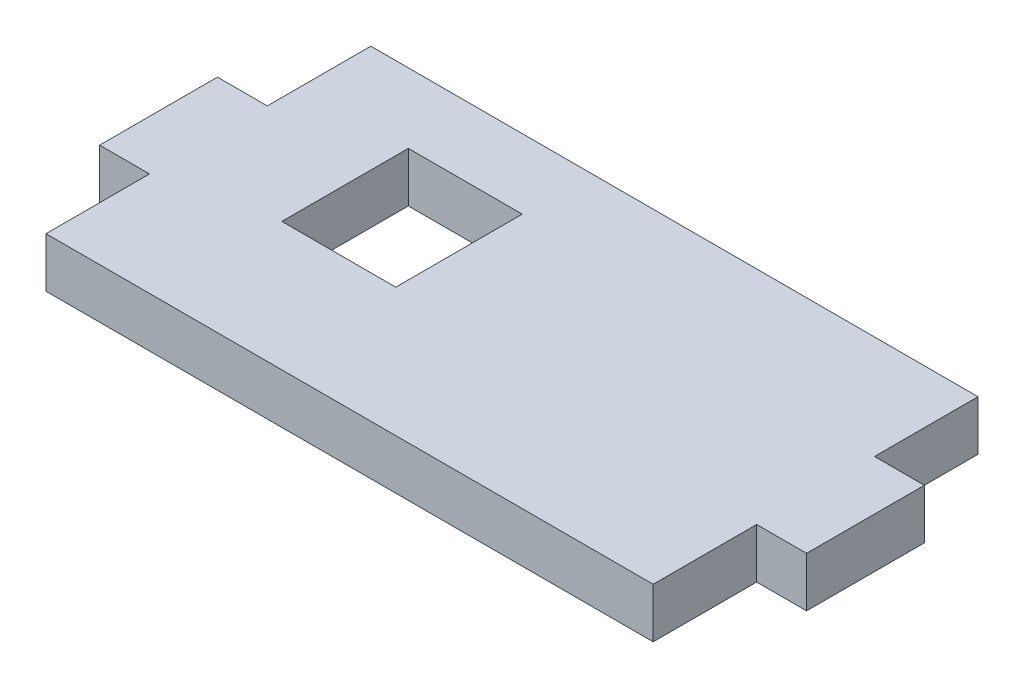
ISO-10303-21;
HEADER;
FILE_DESCRIPTION(('STEP AP214'),'2;1');
FILE_NAME('part.step','',(''),(''),'','','');
FILE_SCHEMA(('AUTOMOTIVE_DESIGN { 1 0 10303 214 1 1 1 1 }'));
ENDSEC;
DATA;
#1=APPLICATION_CONTEXT('core data for automotive mechanical design processes');
#2=APPLICATION_PROTOCOL_DEFINITION('international standard','automotive_design',2000,#1);
#3=PRODUCT_CONTEXT('',#1,'mechanical');
#4=PRODUCT('Part','Part','',(#3));
#5=PRODUCT_RELATED_PRODUCT_CATEGORY('part','',(#4));
#6=PRODUCT_DEFINITION_FORMATION('','',#4);
#7=PRODUCT_DEFINITION_CONTEXT('part definition',#1,'design');
#8=PRODUCT_DEFINITION('design','',#6,#7);
#9=PRODUCT_DEFINITION_SHAPE('','',#8);
#10=(LENGTH_UNIT() NAMED_UNIT(*) SI_UNIT(.MILLI.,.METRE.));
#11=(NAMED_UNIT(*) PLANE_ANGLE_UNIT() SI_UNIT($,.RADIAN.));
#12=(NAMED_UNIT(*) SI_UNIT($,.STERADIAN.) SOLID_ANGLE_UNIT());
#13=UNCERTAINTY_MEASURE_WITH_UNIT(LENGTH_MEASURE(1.E-05),#10,'distance_accuracy_value','');
#14=(GEOMETRIC_REPRESENTATION_CONTEXT(3) GLOBAL_UNCERTAINTY_ASSIGNED_CONTEXT((#13)) GLOBAL_UNIT_ASSIGNED_CONTEXT((#10,
#11,#12)) REPRESENTATION_CONTEXT('',''));
#15=CARTESIAN_POINT('',(0.,0.,0.));
#16=DIRECTION('',(0.,0.,1.));
#17=DIRECTION('',(1.,0.,0.));
#18=AXIS2_PLACEMENT_3D('',#15,#16,#17);
#19=CARTESIAN_POINT('',(45.,3.175,20.675));
#20=DIRECTION('',(-1.,0.,0.));
#21=DIRECTION('',(0.,0.,1.));
#22=AXIS2_PLACEMENT_3D('',#19,#20,#21);
#23=PLANE('',#22);
#24=DIRECTION('',(0.,0.,-1.));
#25=VECTOR('',#24,1.);
#26=CARTESIAN_POINT('',(45.,3.175,20.675));
#27=LINE('',#26,#25);
#28=CARTESIAN_POINT('',(45.,3.175,7.50000000000001));
#29=VERTEX_POINT('',#28);
#30=CARTESIAN_POINT('',(45.,3.175,-7.50000000000001));
#31=VERTEX_POINT('',#30);
#32=EDGE_CURVE('E259',#29,#31,#27,.T.);
#33=ORIENTED_EDGE('',*,*,#32,.F.);
#34=DIRECTION('',(0.,1.,0.));
#35=VECTOR('',#34,1.);
#36=CARTESIAN_POINT('',(45.,-3.175,7.50000000000001));
#37=LINE('',#36,#35);
#38=CARTESIAN_POINT('',(45.,-3.175,7.50000000000001));
#39=VERTEX_POINT('',#38);
#40=EDGE_CURVE('E232',#39,#29,#37,.T.);
#41=ORIENTED_EDGE('',*,*,#40,.F.);
#42=DIRECTION('',(0.,0.,-1.));
#43=VECTOR('',#42,1.);
#44=CARTESIAN_POINT('',(45.,-3.175,20.675));
#45=LINE('',#44,#43);
#46=CARTESIAN_POINT('',(45.,-3.175,-7.50000000000001));
#47=VERTEX_POINT('',#46);
#48=EDGE_CURVE('E255',#39,#47,#45,.T.);
#49=ORIENTED_EDGE('',*,*,#48,.T.);
#50=DIRECTION('',(0.,1.,0.));
#51=VECTOR('',#50,1.);
#52=CARTESIAN_POINT('',(45.,-3.175,-7.50000000000001));
#53=LINE('',#52,#51);
#54=EDGE_CURVE('E198',#47,#31,#53,.T.);
#55=ORIENTED_EDGE('',*,*,#54,.T.);
#56=EDGE_LOOP('',(#33,#41,#49,#55));
#57=FACE_BOUND('',#56,.T.);
#58=ADVANCED_FACE('F36',(#57),#23,.F.);
#59=CARTESIAN_POINT('',(-45.,3.175,-20.675));
#60=DIRECTION('',(0.,0.,1.));
#61=DIRECTION('',(1.,0.,0.));
#62=AXIS2_PLACEMENT_3D('',#59,#60,#61);
#63=PLANE('',#62);
#64=DIRECTION('',(-1.,0.,0.));
#65=VECTOR('',#64,1.);
#66=CARTESIAN_POINT('',(-45.,3.175,-20.675));
#67=LINE('',#66,#65);
#68=CARTESIAN_POINT('',(38.65,3.175,-20.675));
#69=VERTEX_POINT('',#68);
#70=CARTESIAN_POINT('',(-38.65,3.175,-20.675));
#71=VERTEX_POINT('',#70);
#72=EDGE_CURVE('E262',#69,#71,#67,.T.);
#73=ORIENTED_EDGE('',*,*,#72,.F.);
#74=DIRECTION('',(0.,1.,0.));
#75=VECTOR('',#74,1.);
#76=CARTESIAN_POINT('',(38.65,-3.175,-20.675));
#77=LINE('',#76,#75);
#78=CARTESIAN_POINT('',(38.65,-3.175,-20.675));
#79=VERTEX_POINT('',#78);
#80=EDGE_CURVE('E214',#79,#69,#77,.T.);
#81=ORIENTED_EDGE('',*,*,#80,.F.);
#82=DIRECTION('',(-1.,0.,0.));
#83=VECTOR('',#82,1.);
#84=CARTESIAN_POINT('',(-45.,-3.175,-20.675));
#85=LINE('',#84,#83);
#86=CARTESIAN_POINT('',(-38.65,-3.175,-20.675));
#87=VERTEX_POINT('',#86);
#88=EDGE_CURVE('E269',#79,#87,#85,.T.);
#89=ORIENTED_EDGE('',*,*,#88,.T.);
#90=DIRECTION('',(0.,1.,0.));
#91=VECTOR('',#90,1.);
#92=CARTESIAN_POINT('',(-38.65,-3.175,-20.675));
#93=LINE('',#92,#91);
#94=EDGE_CURVE('E200',#87,#71,#93,.T.);
#95=ORIENTED_EDGE('',*,*,#94,.T.);
#96=EDGE_LOOP('',(#73,#81,#89,#95));
#97=FACE_BOUND('',#96,.T.);
#98=ADVANCED_FACE('F314',(#97),#63,.F.);
#99=CARTESIAN_POINT('',(-45.,3.175,20.675));
#100=DIRECTION('',(1.,0.,0.));
#101=DIRECTION('',(0.,0.,-1.));
#102=AXIS2_PLACEMENT_3D('',#99,#100,#101);
#103=PLANE('',#102);
#104=DIRECTION('',(0.,0.,1.));
#105=VECTOR('',#104,1.);
#106=CARTESIAN_POINT('',(-45.,3.175,20.675));
#107=LINE('',#106,#105);
#108=CARTESIAN_POINT('',(-45.,3.175,-7.5));
#109=VERTEX_POINT('',#108);
#110=CARTESIAN_POINT('',(-45.,3.175,7.5));
#111=VERTEX_POINT('',#110);
#112=EDGE_CURVE('E44',#109,#111,#107,.T.);
#113=ORIENTED_EDGE('',*,*,#112,.F.);
#114=DIRECTION('',(0.,1.,0.));
#115=VECTOR('',#114,1.);
#116=CARTESIAN_POINT('',(-45.,-3.175,-7.5));
#117=LINE('',#116,#115);
#118=CARTESIAN_POINT('',(-45.,-3.175,-7.5));
#119=VERTEX_POINT('',#118);
#120=EDGE_CURVE('E194',#119,#109,#117,.T.);
#121=ORIENTED_EDGE('',*,*,#120,.F.);
#122=DIRECTION('',(0.,0.,1.));
#123=VECTOR('',#122,1.);
#124=CARTESIAN_POINT('',(-45.,-3.175,20.675));
#125=LINE('',#124,#123);
#126=CARTESIAN_POINT('',(-45.,-3.175,7.5));
#127=VERTEX_POINT('',#126);
#128=EDGE_CURVE('E271',#119,#127,#125,.T.);
#129=ORIENTED_EDGE('',*,*,#128,.T.);
#130=DIRECTION('',(0.,1.,0.));
#131=VECTOR('',#130,1.);
#132=CARTESIAN_POINT('',(-45.,-3.175,7.5));
#133=LINE('',#132,#131);
#134=EDGE_CURVE('E252',#127,#111,#133,.T.);
#135=ORIENTED_EDGE('',*,*,#134,.T.);
#136=EDGE_LOOP('',(#113,#121,#129,#135));
#137=FACE_BOUND('',#136,.T.);
#138=ADVANCED_FACE('F307',(#137),#103,.F.);
#139=CARTESIAN_POINT('',(-45.,3.175,20.675));
#140=DIRECTION('',(0.,0.,-1.));
#141=DIRECTION('',(-1.,0.,0.));
#142=AXIS2_PLACEMENT_3D('',#139,#140,#141);
#143=PLANE('',#142);
#144=DIRECTION('',(1.,0.,0.));
#145=VECTOR('',#144,1.);
#146=CARTESIAN_POINT('',(-45.,-3.175,20.675));
#147=LINE('',#146,#145);
#148=CARTESIAN_POINT('',(-38.65,-3.175,20.675));
#149=VERTEX_POINT('',#148);
#150=CARTESIAN_POINT('',(38.65,-3.175,20.675));
#151=VERTEX_POINT('',#150);
#152=EDGE_CURVE('E39',#149,#151,#147,.T.);
#153=ORIENTED_EDGE('',*,*,#152,.T.);
#154=DIRECTION('',(0.,1.,0.));
#155=VECTOR('',#154,1.);
#156=CARTESIAN_POINT('',(38.65,-3.175,20.675));
#157=LINE('',#156,#155);
#158=CARTESIAN_POINT('',(38.65,3.175,20.675));
#159=VERTEX_POINT('',#158);
#160=EDGE_CURVE('E218',#151,#159,#157,.T.);
#161=ORIENTED_EDGE('',*,*,#160,.T.);
#162=DIRECTION('',(1.,0.,0.));
#163=VECTOR('',#162,1.);
#164=CARTESIAN_POINT('',(-45.,3.175,20.675));
#165=LINE('',#164,#163);
#166=CARTESIAN_POINT('',(-38.65,3.175,20.675));
#167=VERTEX_POINT('',#166);
#168=EDGE_CURVE('E11',#167,#159,#165,.T.);
#169=ORIENTED_EDGE('',*,*,#168,.F.);
#170=DIRECTION('',(0.,1.,0.));
#171=VECTOR('',#170,1.);
#172=CARTESIAN_POINT('',(-38.65,-3.175,20.675));
#173=LINE('',#172,#171);
#174=EDGE_CURVE('E248',#149,#167,#173,.T.);
#175=ORIENTED_EDGE('',*,*,#174,.F.);
#176=EDGE_LOOP('',(#153,#161,#169,#175));
#177=FACE_BOUND('',#176,.T.);
#178=ADVANCED_FACE('F280',(#177),#143,.F.);
#179=CARTESIAN_POINT('',(0.,3.175,0.));
#180=DIRECTION('',(0.,-1.,0.));
#181=DIRECTION('',(0.,0.,-1.));
#182=AXIS2_PLACEMENT_3D('',#179,#180,#181);
#183=PLANE('',#182);
#184=DIRECTION('',(1.,0.,0.));
#185=VECTOR('',#184,1.);
#186=CARTESIAN_POINT('',(-10.4899999999817,3.175,-11.7924402745096));
#187=LINE('',#186,#185);
#188=CARTESIAN_POINT('',(-24.9899999999817,3.175,-11.7924402745096));
#189=VERTEX_POINT('',#188);
#190=CARTESIAN_POINT('',(-10.4899999999817,3.175,-11.7924402745096));
#191=VERTEX_POINT('',#190);
#192=EDGE_CURVE('E158',#189,#191,#187,.T.);
#193=ORIENTED_EDGE('',*,*,#192,.T.);
#194=DIRECTION('',(0.,0.,1.));
#195=VECTOR('',#194,1.);
#196=CARTESIAN_POINT('',(-10.4899999999817,3.175,4.30755972549035));
#197=LINE('',#196,#195);
#198=CARTESIAN_POINT('',(-10.4899999999817,3.175,4.30755972549035));
#199=VERTEX_POINT('',#198);
#200=EDGE_CURVE('E152',#191,#199,#197,.T.);
#201=ORIENTED_EDGE('',*,*,#200,.T.);
#202=DIRECTION('',(-1.,0.,0.));
#203=VECTOR('',#202,1.);
#204=CARTESIAN_POINT('',(-10.4899999999817,3.175,4.30755972549035));
#205=LINE('',#204,#203);
#206=CARTESIAN_POINT('',(-24.9899999999817,3.175,4.30755972549035));
#207=VERTEX_POINT('',#206);
#208=EDGE_CURVE('E161',#199,#207,#205,.T.);
#209=ORIENTED_EDGE('',*,*,#208,.T.);
#210=DIRECTION('',(0.,0.,-1.));
#211=VECTOR('',#210,1.);
#212=CARTESIAN_POINT('',(-24.9899999999817,3.175,4.30755972549035));
#213=LINE('',#212,#211);
#214=EDGE_CURVE('E52',#207,#189,#213,.T.);
#215=ORIENTED_EDGE('',*,*,#214,.T.);
#216=EDGE_LOOP('',(#193,#201,#209,#215));
#217=FACE_BOUND('',#216,.T.);
#218=ORIENTED_EDGE('',*,*,#168,.T.);
#219=DIRECTION('',(0.,0.,1.));
#220=VECTOR('',#219,1.);
#221=CARTESIAN_POINT('',(38.65,3.175,20.675));
#222=LINE('',#221,#220);
#223=CARTESIAN_POINT('',(38.65,3.175,7.50000000000001));
#224=VERTEX_POINT('',#223);
#225=EDGE_CURVE('E229',#224,#159,#222,.T.);
#226=ORIENTED_EDGE('',*,*,#225,.F.);
#227=DIRECTION('',(-1.,0.,0.));
#228=VECTOR('',#227,1.);
#229=CARTESIAN_POINT('',(45.,3.175,7.50000000000001));
#230=LINE('',#229,#228);
#231=EDGE_CURVE('E183',#29,#224,#230,.T.);
#232=ORIENTED_EDGE('',*,*,#231,.F.);
#233=ORIENTED_EDGE('',*,*,#32,.T.);
#234=DIRECTION('',(1.,0.,0.));
#235=VECTOR('',#234,1.);
#236=CARTESIAN_POINT('',(45.,3.175,-7.50000000000001));
#237=LINE('',#236,#235);
#238=CARTESIAN_POINT('',(38.65,3.175,-7.50000000000001));
#239=VERTEX_POINT('',#238);
#240=EDGE_CURVE('E211',#239,#31,#237,.T.);
#241=ORIENTED_EDGE('',*,*,#240,.F.);
#242=DIRECTION('',(0.,0.,1.));
#243=VECTOR('',#242,1.);
#244=CARTESIAN_POINT('',(38.65,3.175,-20.675));
#245=LINE('',#244,#243);
#246=EDGE_CURVE('E215',#69,#239,#245,.T.);
#247=ORIENTED_EDGE('',*,*,#246,.F.);
#248=ORIENTED_EDGE('',*,*,#72,.T.);
#249=DIRECTION('',(0.,0.,-1.));
#250=VECTOR('',#249,1.);
#251=CARTESIAN_POINT('',(-38.65,3.175,-20.675));
#252=LINE('',#251,#250);
#253=CARTESIAN_POINT('',(-38.65,3.175,-7.5));
#254=VERTEX_POINT('',#253);
#255=EDGE_CURVE('E191',#254,#71,#252,.T.);
#256=ORIENTED_EDGE('',*,*,#255,.F.);
#257=DIRECTION('',(1.,0.,0.));
#258=VECTOR('',#257,1.);
#259=CARTESIAN_POINT('',(-45.,3.175,-7.5));
#260=LINE('',#259,#258);
#261=EDGE_CURVE('E195',#109,#254,#260,.T.);
#262=ORIENTED_EDGE('',*,*,#261,.F.);
#263=ORIENTED_EDGE('',*,*,#112,.T.);
#264=DIRECTION('',(-1.,0.,0.));
#265=VECTOR('',#264,1.);
#266=CARTESIAN_POINT('',(-45.,3.175,7.5));
#267=LINE('',#266,#265);
#268=CARTESIAN_POINT('',(-38.65,3.175,7.5));
#269=VERTEX_POINT('',#268);
#270=EDGE_CURVE('E245',#269,#111,#267,.T.);
#271=ORIENTED_EDGE('',*,*,#270,.F.);
#272=DIRECTION('',(0.,0.,-1.));
#273=VECTOR('',#272,1.);
#274=CARTESIAN_POINT('',(-38.65,3.175,20.675));
#275=LINE('',#274,#273);
#276=EDGE_CURVE('E203',#167,#269,#275,.T.);
#277=ORIENTED_EDGE('',*,*,#276,.F.);
#278=EDGE_LOOP('',(#218,#226,#232,#233,#241,#247,#248,#256,#262,#263,#271,#277));
#279=FACE_BOUND('',#278,.T.);
#280=ADVANCED_FACE('F165',(#217,#279),#183,.F.);
#281=CARTESIAN_POINT('',(0.,-3.175,0.));
#282=DIRECTION('',(0.,-1.,0.));
#283=DIRECTION('',(0.,0.,-1.));
#284=AXIS2_PLACEMENT_3D('',#281,#282,#283);
#285=PLANE('',#284);
#286=DIRECTION('',(0.,0.,1.));
#287=VECTOR('',#286,1.);
#288=CARTESIAN_POINT('',(-10.4899999999817,-3.175,4.30755972549035));
#289=LINE('',#288,#287);
#290=CARTESIAN_POINT('',(-10.4899999999817,-3.175,-11.7924402745096));
#291=VERTEX_POINT('',#290);
#292=CARTESIAN_POINT('',(-10.4899999999817,-3.175,4.30755972549035));
#293=VERTEX_POINT('',#292);
#294=EDGE_CURVE('E60',#291,#293,#289,.T.);
#295=ORIENTED_EDGE('',*,*,#294,.F.);
#296=DIRECTION('',(1.,0.,0.));
#297=VECTOR('',#296,1.);
#298=CARTESIAN_POINT('',(-10.4899999999817,-3.175,-11.7924402745096));
#299=LINE('',#298,#297);
#300=CARTESIAN_POINT('',(-24.9899999999817,-3.175,-11.7924402745096));
#301=VERTEX_POINT('',#300);
#302=EDGE_CURVE('E168',#301,#291,#299,.T.);
#303=ORIENTED_EDGE('',*,*,#302,.F.);
#304=DIRECTION('',(0.,0.,-1.));
#305=VECTOR('',#304,1.);
#306=CARTESIAN_POINT('',(-24.9899999999817,-3.175,4.30755972549035));
#307=LINE('',#306,#305);
#308=CARTESIAN_POINT('',(-24.9899999999817,-3.175,4.30755972549035));
#309=VERTEX_POINT('',#308);
#310=EDGE_CURVE('E171',#309,#301,#307,.T.);
#311=ORIENTED_EDGE('',*,*,#310,.F.);
#312=DIRECTION('',(-1.,0.,0.));
#313=VECTOR('',#312,1.);
#314=CARTESIAN_POINT('',(-10.4899999999817,-3.175,4.30755972549035));
#315=LINE('',#314,#313);
#316=EDGE_CURVE('E177',#293,#309,#315,.T.);
#317=ORIENTED_EDGE('',*,*,#316,.F.);
#318=EDGE_LOOP('',(#295,#303,#311,#317));
#319=FACE_BOUND('',#318,.T.);
#320=DIRECTION('',(0.,0.,1.));
#321=VECTOR('',#320,1.);
#322=CARTESIAN_POINT('',(38.65,-3.175,20.675));
#323=LINE('',#322,#321);
#324=CARTESIAN_POINT('',(38.65,-3.175,7.50000000000001));
#325=VERTEX_POINT('',#324);
#326=EDGE_CURVE('E228',#325,#151,#323,.T.);
#327=ORIENTED_EDGE('',*,*,#326,.T.);
#328=ORIENTED_EDGE('',*,*,#152,.F.);
#329=DIRECTION('',(0.,0.,-1.));
#330=VECTOR('',#329,1.);
#331=CARTESIAN_POINT('',(-38.65,-3.175,20.675));
#332=LINE('',#331,#330);
#333=CARTESIAN_POINT('',(-38.65,-3.175,7.5));
#334=VERTEX_POINT('',#333);
#335=EDGE_CURVE('E241',#149,#334,#332,.T.);
#336=ORIENTED_EDGE('',*,*,#335,.T.);
#337=DIRECTION('',(-1.,0.,0.));
#338=VECTOR('',#337,1.);
#339=CARTESIAN_POINT('',(-45.,-3.175,7.5));
#340=LINE('',#339,#338);
#341=EDGE_CURVE('E244',#334,#127,#340,.T.);
#342=ORIENTED_EDGE('',*,*,#341,.T.);
#343=ORIENTED_EDGE('',*,*,#128,.F.);
#344=DIRECTION('',(1.,0.,0.));
#345=VECTOR('',#344,1.);
#346=CARTESIAN_POINT('',(-45.,-3.175,-7.5));
#347=LINE('',#346,#345);
#348=CARTESIAN_POINT('',(-38.65,-3.175,-7.5));
#349=VERTEX_POINT('',#348);
#350=EDGE_CURVE('E187',#119,#349,#347,.T.);
#351=ORIENTED_EDGE('',*,*,#350,.T.);
#352=DIRECTION('',(0.,0.,-1.));
#353=VECTOR('',#352,1.);
#354=CARTESIAN_POINT('',(-38.65,-3.175,-20.675));
#355=LINE('',#354,#353);
#356=EDGE_CURVE('E190',#349,#87,#355,.T.);
#357=ORIENTED_EDGE('',*,*,#356,.T.);
#358=ORIENTED_EDGE('',*,*,#88,.F.);
#359=DIRECTION('',(0.,0.,1.));
#360=VECTOR('',#359,1.);
#361=CARTESIAN_POINT('',(38.65,-3.175,-20.675));
#362=LINE('',#361,#360);
#363=CARTESIAN_POINT('',(38.65,-3.175,-7.50000000000001));
#364=VERTEX_POINT('',#363);
#365=EDGE_CURVE('E207',#79,#364,#362,.T.);
#366=ORIENTED_EDGE('',*,*,#365,.T.);
#367=DIRECTION('',(1.,0.,0.));
#368=VECTOR('',#367,1.);
#369=CARTESIAN_POINT('',(45.,-3.175,-7.50000000000001));
#370=LINE('',#369,#368);
#371=EDGE_CURVE('E210',#364,#47,#370,.T.);
#372=ORIENTED_EDGE('',*,*,#371,.T.);
#373=ORIENTED_EDGE('',*,*,#48,.F.);
#374=DIRECTION('',(-1.,0.,0.));
#375=VECTOR('',#374,1.);
#376=CARTESIAN_POINT('',(45.,-3.175,7.50000000000001));
#377=LINE('',#376,#375);
#378=EDGE_CURVE('E225',#39,#325,#377,.T.);
#379=ORIENTED_EDGE('',*,*,#378,.T.);
#380=EDGE_LOOP('',(#327,#328,#336,#342,#343,#351,#357,#358,#366,#372,#373,#379));
#381=FACE_BOUND('',#380,.T.);
#382=ADVANCED_FACE('F283',(#319,#381),#285,.T.);
#383=CARTESIAN_POINT('',(-45.,-3.175,7.5));
#384=DIRECTION('',(0.,0.,-1.));
#385=DIRECTION('',(-1.,0.,0.));
#386=AXIS2_PLACEMENT_3D('',#383,#384,#385);
#387=PLANE('',#386);
#388=ORIENTED_EDGE('',*,*,#270,.T.);
#389=ORIENTED_EDGE('',*,*,#134,.F.);
#390=ORIENTED_EDGE('',*,*,#341,.F.);
#391=DIRECTION('',(0.,1.,0.));
#392=VECTOR('',#391,1.);
#393=CARTESIAN_POINT('',(-38.65,-3.175,7.5));
#394=LINE('',#393,#392);
#395=EDGE_CURVE('E256',#334,#269,#394,.T.);
#396=ORIENTED_EDGE('',*,*,#395,.T.);
#397=EDGE_LOOP('',(#388,#389,#390,#396));
#398=FACE_BOUND('',#397,.T.);
#399=ADVANCED_FACE('F300',(#398),#387,.F.);
#400=CARTESIAN_POINT('',(-38.65,-3.175,20.675));
#401=DIRECTION('',(1.,0.,0.));
#402=DIRECTION('',(0.,0.,-1.));
#403=AXIS2_PLACEMENT_3D('',#400,#401,#402);
#404=PLANE('',#403);
#405=ORIENTED_EDGE('',*,*,#276,.T.);
#406=ORIENTED_EDGE('',*,*,#395,.F.);
#407=ORIENTED_EDGE('',*,*,#335,.F.);
#408=ORIENTED_EDGE('',*,*,#174,.T.);
#409=EDGE_LOOP('',(#405,#406,#407,#408));
#410=FACE_BOUND('',#409,.T.);
#411=ADVANCED_FACE('F298',(#410),#404,.F.);
#412=CARTESIAN_POINT('',(-38.65,-3.175,-20.675));
#413=DIRECTION('',(1.,0.,0.));
#414=DIRECTION('',(0.,0.,-1.));
#415=AXIS2_PLACEMENT_3D('',#412,#413,#414);
#416=PLANE('',#415);
#417=ORIENTED_EDGE('',*,*,#255,.T.);
#418=ORIENTED_EDGE('',*,*,#94,.F.);
#419=ORIENTED_EDGE('',*,*,#356,.F.);
#420=DIRECTION('',(0.,1.,0.));
#421=VECTOR('',#420,1.);
#422=CARTESIAN_POINT('',(-38.65,-3.175,-7.5));
#423=LINE('',#422,#421);
#424=EDGE_CURVE('E204',#349,#254,#423,.T.);
#425=ORIENTED_EDGE('',*,*,#424,.T.);
#426=EDGE_LOOP('',(#417,#418,#419,#425));
#427=FACE_BOUND('',#426,.T.);
#428=ADVANCED_FACE('F312',(#427),#416,.F.);
#429=CARTESIAN_POINT('',(-45.,-3.175,-7.5));
#430=DIRECTION('',(0.,0.,1.));
#431=DIRECTION('',(1.,0.,0.));
#432=AXIS2_PLACEMENT_3D('',#429,#430,#431);
#433=PLANE('',#432);
#434=ORIENTED_EDGE('',*,*,#261,.T.);
#435=ORIENTED_EDGE('',*,*,#424,.F.);
#436=ORIENTED_EDGE('',*,*,#350,.F.);
#437=ORIENTED_EDGE('',*,*,#120,.T.);
#438=EDGE_LOOP('',(#434,#435,#436,#437));
#439=FACE_BOUND('',#438,.T.);
#440=ADVANCED_FACE('F304',(#439),#433,.F.);
#441=CARTESIAN_POINT('',(45.,-3.175,-7.50000000000001));
#442=DIRECTION('',(0.,0.,1.));
#443=DIRECTION('',(1.,0.,0.));
#444=AXIS2_PLACEMENT_3D('',#441,#442,#443);
#445=PLANE('',#444);
#446=ORIENTED_EDGE('',*,*,#240,.T.);
#447=ORIENTED_EDGE('',*,*,#54,.F.);
#448=ORIENTED_EDGE('',*,*,#371,.F.);
#449=DIRECTION('',(0.,1.,0.));
#450=VECTOR('',#449,1.);
#451=CARTESIAN_POINT('',(38.65,-3.175,-7.50000000000001));
#452=LINE('',#451,#450);
#453=EDGE_CURVE('E222',#364,#239,#452,.T.);
#454=ORIENTED_EDGE('',*,*,#453,.T.);
#455=EDGE_LOOP('',(#446,#447,#448,#454));
#456=FACE_BOUND('',#455,.T.);
#457=ADVANCED_FACE('F321',(#456),#445,.F.);
#458=CARTESIAN_POINT('',(38.65,-3.175,-20.675));
#459=DIRECTION('',(-1.,0.,0.));
#460=DIRECTION('',(0.,0.,1.));
#461=AXIS2_PLACEMENT_3D('',#458,#459,#460);
#462=PLANE('',#461);
#463=ORIENTED_EDGE('',*,*,#246,.T.);
#464=ORIENTED_EDGE('',*,*,#453,.F.);
#465=ORIENTED_EDGE('',*,*,#365,.F.);
#466=ORIENTED_EDGE('',*,*,#80,.T.);
#467=EDGE_LOOP('',(#463,#464,#465,#466));
#468=FACE_BOUND('',#467,.T.);
#469=ADVANCED_FACE('F318',(#468),#462,.F.);
#470=CARTESIAN_POINT('',(38.65,-3.175,20.675));
#471=DIRECTION('',(-1.,0.,0.));
#472=DIRECTION('',(0.,0.,1.));
#473=AXIS2_PLACEMENT_3D('',#470,#471,#472);
#474=PLANE('',#473);
#475=ORIENTED_EDGE('',*,*,#225,.T.);
#476=ORIENTED_EDGE('',*,*,#160,.F.);
#477=ORIENTED_EDGE('',*,*,#326,.F.);
#478=DIRECTION('',(0.,1.,0.));
#479=VECTOR('',#478,1.);
#480=CARTESIAN_POINT('',(38.65,-3.175,7.50000000000001));
#481=LINE('',#480,#479);
#482=EDGE_CURVE('E238',#325,#224,#481,.T.);
#483=ORIENTED_EDGE('',*,*,#482,.T.);
#484=EDGE_LOOP('',(#475,#476,#477,#483));
#485=FACE_BOUND('',#484,.T.);
#486=ADVANCED_FACE('F287',(#485),#474,.F.);
#487=CARTESIAN_POINT('',(45.,-3.175,7.50000000000001));
#488=DIRECTION('',(0.,0.,-1.));
#489=DIRECTION('',(-1.,0.,0.));
#490=AXIS2_PLACEMENT_3D('',#487,#488,#489);
#491=PLANE('',#490);
#492=ORIENTED_EDGE('',*,*,#231,.T.);
#493=ORIENTED_EDGE('',*,*,#482,.F.);
#494=ORIENTED_EDGE('',*,*,#378,.F.);
#495=ORIENTED_EDGE('',*,*,#40,.T.);
#496=EDGE_LOOP('',(#492,#493,#494,#495));
#497=FACE_BOUND('',#496,.T.);
#498=ADVANCED_FACE('F289',(#497),#491,.F.);
#499=CARTESIAN_POINT('',(-10.4899999999817,3.175,4.30755972549035));
#500=DIRECTION('',(1.,0.,0.));
#501=DIRECTION('',(0.,0.,-1.));
#502=AXIS2_PLACEMENT_3D('',#499,#500,#501);
#503=PLANE('',#502);
#504=ORIENTED_EDGE('',*,*,#294,.T.);
#505=DIRECTION('',(0.,-1.,0.));
#506=VECTOR('',#505,1.);
#507=CARTESIAN_POINT('',(-10.4899999999817,3.175,4.30755972549035));
#508=LINE('',#507,#506);
#509=EDGE_CURVE('E148',#199,#293,#508,.T.);
#510=ORIENTED_EDGE('',*,*,#509,.F.);
#511=ORIENTED_EDGE('',*,*,#200,.F.);
#512=DIRECTION('',(0.,-1.,0.));
#513=VECTOR('',#512,1.);
#514=CARTESIAN_POINT('',(-10.4899999999817,3.175,-11.7924402745096));
#515=LINE('',#514,#513);
#516=EDGE_CURVE('E181',#191,#291,#515,.T.);
#517=ORIENTED_EDGE('',*,*,#516,.T.);
#518=EDGE_LOOP('',(#504,#510,#511,#517));
#519=FACE_BOUND('',#518,.T.);
#520=ADVANCED_FACE('F150',(#519),#503,.F.);
#521=CARTESIAN_POINT('',(-10.4899999999817,3.175,-11.7924402745096));
#522=DIRECTION('',(0.,0.,-1.));
#523=DIRECTION('',(-1.,0.,0.));
#524=AXIS2_PLACEMENT_3D('',#521,#522,#523);
#525=PLANE('',#524);
#526=ORIENTED_EDGE('',*,*,#302,.T.);
#527=ORIENTED_EDGE('',*,*,#516,.F.);
#528=ORIENTED_EDGE('',*,*,#192,.F.);
#529=DIRECTION('',(0.,-1.,0.));
#530=VECTOR('',#529,1.);
#531=CARTESIAN_POINT('',(-24.9899999999817,3.175,-11.7924402745096));
#532=LINE('',#531,#530);
#533=EDGE_CURVE('E184',#189,#301,#532,.T.);
#534=ORIENTED_EDGE('',*,*,#533,.T.);
#535=EDGE_LOOP('',(#526,#527,#528,#534));
#536=FACE_BOUND('',#535,.T.);
#537=ADVANCED_FACE('F357',(#536),#525,.F.);
#538=CARTESIAN_POINT('',(-24.9899999999817,3.175,4.30755972549035));
#539=DIRECTION('',(-1.,0.,0.));
#540=DIRECTION('',(0.,0.,1.));
#541=AXIS2_PLACEMENT_3D('',#538,#539,#540);
#542=PLANE('',#541);
#543=ORIENTED_EDGE('',*,*,#310,.T.);
#544=ORIENTED_EDGE('',*,*,#533,.F.);
#545=ORIENTED_EDGE('',*,*,#214,.F.);
#546=DIRECTION('',(0.,-1.,0.));
#547=VECTOR('',#546,1.);
#548=CARTESIAN_POINT('',(-24.9899999999817,3.175,4.30755972549035));
#549=LINE('',#548,#547);
#550=EDGE_CURVE('E157',#207,#309,#549,.T.);
#551=ORIENTED_EDGE('',*,*,#550,.T.);
#552=EDGE_LOOP('',(#543,#544,#545,#551));
#553=FACE_BOUND('',#552,.T.);
#554=ADVANCED_FACE('F360',(#553),#542,.F.);
#555=CARTESIAN_POINT('',(-10.4899999999817,3.175,4.30755972549035));
#556=DIRECTION('',(0.,0.,1.));
#557=DIRECTION('',(1.,0.,0.));
#558=AXIS2_PLACEMENT_3D('',#555,#556,#557);
#559=PLANE('',#558);
#560=ORIENTED_EDGE('',*,*,#316,.T.);
#561=ORIENTED_EDGE('',*,*,#550,.F.);
#562=ORIENTED_EDGE('',*,*,#208,.F.);
#563=ORIENTED_EDGE('',*,*,#509,.T.);
#564=EDGE_LOOP('',(#560,#561,#562,#563));
#565=FACE_BOUND('',#564,.T.);
#566=ADVANCED_FACE('F162',(#565),#559,.F.);
#567=CLOSED_SHELL('',(#58,#98,#138,#178,#280,#382,#399,#411,#428,#440,#457,#469,#486,#498,#520,
#537,#554,#566));
#568=MANIFOLD_SOLID_BREP('B2',#567);
#569=ADVANCED_BREP_SHAPE_REPRESENTATION('',(#18,#568),#14);
#570=SHAPE_DEFINITION_REPRESENTATION(#9,#569);
ENDSEC;
END-ISO-10303-21;
